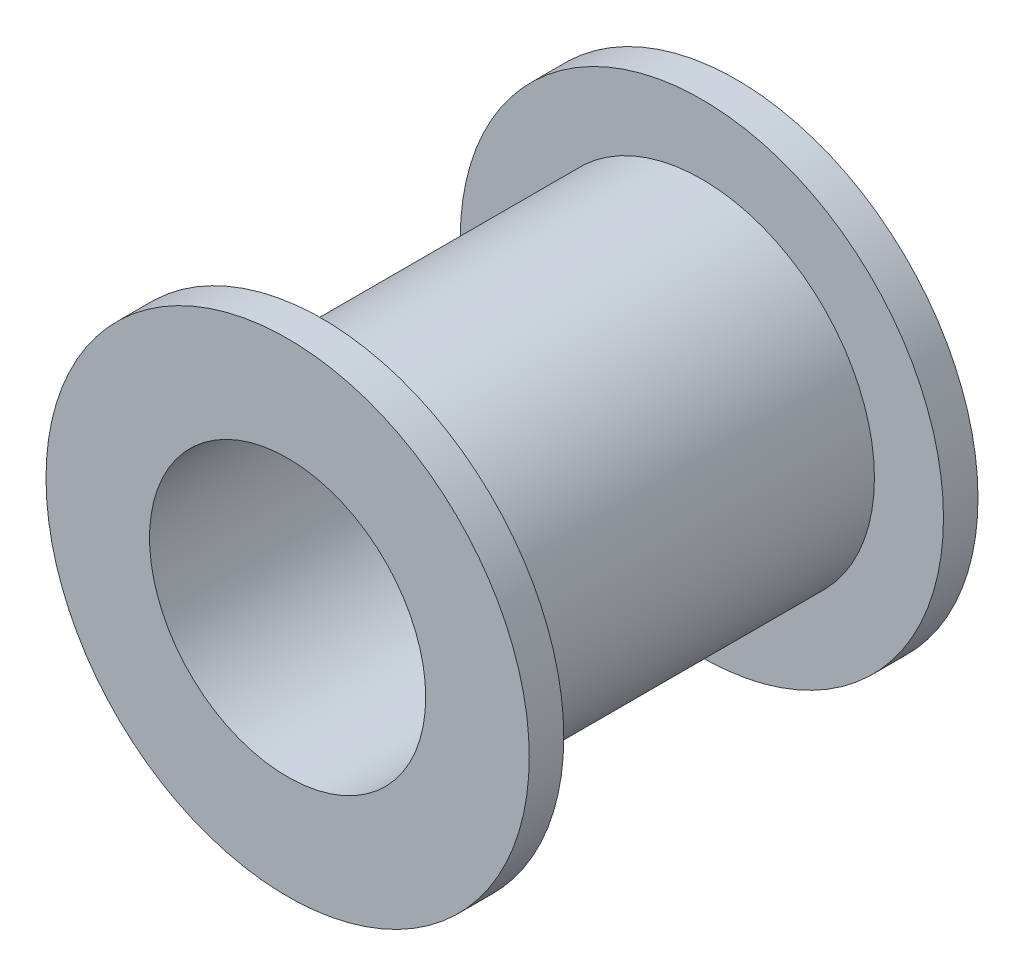
ISO-10303-21;
HEADER;
FILE_DESCRIPTION(('STEP AP214'),'2;1');
FILE_NAME('part.step','',(''),(''),'','','');
FILE_SCHEMA(('AUTOMOTIVE_DESIGN { 1 0 10303 214 1 1 1 1 }'));
ENDSEC;
DATA;
#1=APPLICATION_CONTEXT('core data for automotive mechanical design processes');
#2=APPLICATION_PROTOCOL_DEFINITION('international standard','automotive_design',2000,#1);
#3=PRODUCT_CONTEXT('',#1,'mechanical');
#4=PRODUCT('Part','Part','',(#3));
#5=PRODUCT_RELATED_PRODUCT_CATEGORY('part','',(#4));
#6=PRODUCT_DEFINITION_FORMATION('','',#4);
#7=PRODUCT_DEFINITION_CONTEXT('part definition',#1,'design');
#8=PRODUCT_DEFINITION('design','',#6,#7);
#9=PRODUCT_DEFINITION_SHAPE('','',#8);
#10=(LENGTH_UNIT() NAMED_UNIT(*) SI_UNIT(.MILLI.,.METRE.));
#11=(NAMED_UNIT(*) PLANE_ANGLE_UNIT() SI_UNIT($,.RADIAN.));
#12=(NAMED_UNIT(*) SI_UNIT($,.STERADIAN.) SOLID_ANGLE_UNIT());
#13=UNCERTAINTY_MEASURE_WITH_UNIT(LENGTH_MEASURE(1.E-05),#10,'distance_accuracy_value','');
#14=(GEOMETRIC_REPRESENTATION_CONTEXT(3) GLOBAL_UNCERTAINTY_ASSIGNED_CONTEXT((#13)) GLOBAL_UNIT_ASSIGNED_CONTEXT((#10,
#11,#12)) REPRESENTATION_CONTEXT('',''));
#15=CARTESIAN_POINT('',(0.,0.,0.));
#16=DIRECTION('',(0.,0.,1.));
#17=DIRECTION('',(1.,0.,0.));
#18=AXIS2_PLACEMENT_3D('',#15,#16,#17);
#19=CARTESIAN_POINT('',(0.,0.,0.1));
#20=DIRECTION('',(0.,0.,-1.));
#21=DIRECTION('',(1.,0.,0.));
#22=AXIS2_PLACEMENT_3D('',#19,#20,#21);
#23=CYLINDRICAL_SURFACE('',#22,0.4);
#24=DIRECTION('',(0.,0.,-1.));
#25=VECTOR('',#24,1.);
#26=CARTESIAN_POINT('',(0.4,0.,0.1));
#27=LINE('',#26,#25);
#28=CARTESIAN_POINT('',(0.4,0.,0.1));
#29=VERTEX_POINT('',#28);
#30=CARTESIAN_POINT('',(0.4,0.,-1.2));
#31=VERTEX_POINT('',#30);
#32=EDGE_CURVE('E11',#29,#31,#27,.T.);
#33=ORIENTED_EDGE('',*,*,#32,.T.);
#34=CARTESIAN_POINT('',(0.,0.,-1.2));
#35=DIRECTION('',(0.,0.,-1.));
#36=DIRECTION('',(1.,0.,0.));
#37=AXIS2_PLACEMENT_3D('',#34,#35,#36);
#38=CIRCLE('',#37,0.4);
#39=EDGE_CURVE('E119',#31,#31,#38,.T.);
#40=ORIENTED_EDGE('',*,*,#39,.T.);
#41=ORIENTED_EDGE('',*,*,#32,.F.);
#42=CARTESIAN_POINT('',(0.,0.,0.1));
#43=DIRECTION('',(0.,0.,-1.));
#44=DIRECTION('',(1.,0.,0.));
#45=AXIS2_PLACEMENT_3D('',#42,#43,#44);
#46=CIRCLE('',#45,0.4);
#47=EDGE_CURVE('E28',#29,#29,#46,.T.);
#48=ORIENTED_EDGE('',*,*,#47,.F.);
#49=EDGE_LOOP('',(#33,#40,#41,#48));
#50=FACE_BOUND('',#49,.T.);
#51=ADVANCED_FACE('F17',(#50),#23,.F.);
#52=CARTESIAN_POINT('',(0.,0.,0.1));
#53=DIRECTION('',(0.,0.,-1.));
#54=DIRECTION('',(0.,-1.,0.));
#55=AXIS2_PLACEMENT_3D('',#52,#53,#54);
#56=PLANE('',#55);
#57=ORIENTED_EDGE('',*,*,#47,.T.);
#58=EDGE_LOOP('',(#57));
#59=FACE_BOUND('',#58,.T.);
#60=CARTESIAN_POINT('',(0.,0.,0.1));
#61=DIRECTION('',(0.,0.,-1.));
#62=DIRECTION('',(1.,0.,0.));
#63=AXIS2_PLACEMENT_3D('',#60,#61,#62);
#64=CIRCLE('',#63,0.7);
#65=CARTESIAN_POINT('',(0.7,0.,0.1));
#66=VERTEX_POINT('',#65);
#67=EDGE_CURVE('E95',#66,#66,#64,.T.);
#68=ORIENTED_EDGE('',*,*,#67,.F.);
#69=EDGE_LOOP('',(#68));
#70=FACE_BOUND('',#69,.T.);
#71=ADVANCED_FACE('F134',(#59,#70),#56,.F.);
#72=CARTESIAN_POINT('',(0.,0.,0.));
#73=DIRECTION('',(0.,0.,1.));
#74=DIRECTION('',(1.,0.,0.));
#75=AXIS2_PLACEMENT_3D('',#72,#73,#74);
#76=CYLINDRICAL_SURFACE('',#75,0.7);
#77=DIRECTION('',(0.,0.,1.));
#78=VECTOR('',#77,1.);
#79=CARTESIAN_POINT('',(0.7,0.,0.));
#80=LINE('',#79,#78);
#81=CARTESIAN_POINT('',(0.7,0.,0.));
#82=VERTEX_POINT('',#81);
#83=EDGE_CURVE('E67',#82,#66,#80,.T.);
#84=ORIENTED_EDGE('',*,*,#83,.T.);
#85=ORIENTED_EDGE('',*,*,#67,.T.);
#86=ORIENTED_EDGE('',*,*,#83,.F.);
#87=CARTESIAN_POINT('',(0.,0.,0.));
#88=DIRECTION('',(0.,0.,-1.));
#89=DIRECTION('',(1.,0.,0.));
#90=AXIS2_PLACEMENT_3D('',#87,#88,#89);
#91=CIRCLE('',#90,0.7);
#92=EDGE_CURVE('E82',#82,#82,#91,.T.);
#93=ORIENTED_EDGE('',*,*,#92,.F.);
#94=EDGE_LOOP('',(#84,#85,#86,#93));
#95=FACE_BOUND('',#94,.T.);
#96=ADVANCED_FACE('F139',(#95),#76,.T.);
#97=CARTESIAN_POINT('',(0.,0.,0.));
#98=DIRECTION('',(0.,0.,-1.));
#99=DIRECTION('',(0.,-1.,0.));
#100=AXIS2_PLACEMENT_3D('',#97,#98,#99);
#101=PLANE('',#100);
#102=ORIENTED_EDGE('',*,*,#92,.T.);
#103=EDGE_LOOP('',(#102));
#104=FACE_BOUND('',#103,.T.);
#105=CARTESIAN_POINT('',(0.,0.,0.));
#106=DIRECTION('',(0.,0.,-1.));
#107=DIRECTION('',(1.,0.,0.));
#108=AXIS2_PLACEMENT_3D('',#105,#106,#107);
#109=CIRCLE('',#108,0.5);
#110=CARTESIAN_POINT('',(0.5,0.,0.));
#111=VERTEX_POINT('',#110);
#112=EDGE_CURVE('E75',#111,#111,#109,.T.);
#113=ORIENTED_EDGE('',*,*,#112,.F.);
#114=EDGE_LOOP('',(#113));
#115=FACE_BOUND('',#114,.T.);
#116=ADVANCED_FACE('F144',(#104,#115),#101,.T.);
#117=CARTESIAN_POINT('',(0.,0.,-1.1));
#118=DIRECTION('',(0.,0.,1.));
#119=DIRECTION('',(1.,0.,0.));
#120=AXIS2_PLACEMENT_3D('',#117,#118,#119);
#121=CYLINDRICAL_SURFACE('',#120,0.5);
#122=DIRECTION('',(0.,0.,1.));
#123=VECTOR('',#122,1.);
#124=CARTESIAN_POINT('',(0.5,0.,-1.1));
#125=LINE('',#124,#123);
#126=CARTESIAN_POINT('',(0.5,0.,-1.1));
#127=VERTEX_POINT('',#126);
#128=EDGE_CURVE('E78',#127,#111,#125,.T.);
#129=ORIENTED_EDGE('',*,*,#128,.T.);
#130=ORIENTED_EDGE('',*,*,#112,.T.);
#131=ORIENTED_EDGE('',*,*,#128,.F.);
#132=CARTESIAN_POINT('',(0.,0.,-1.1));
#133=DIRECTION('',(0.,0.,-1.));
#134=DIRECTION('',(1.,0.,0.));
#135=AXIS2_PLACEMENT_3D('',#132,#133,#134);
#136=CIRCLE('',#135,0.5);
#137=EDGE_CURVE('E89',#127,#127,#136,.T.);
#138=ORIENTED_EDGE('',*,*,#137,.F.);
#139=EDGE_LOOP('',(#129,#130,#131,#138));
#140=FACE_BOUND('',#139,.T.);
#141=ADVANCED_FACE('F76',(#140),#121,.T.);
#142=CARTESIAN_POINT('',(0.,0.,-1.1));
#143=DIRECTION('',(0.,0.,-1.));
#144=DIRECTION('',(0.,-1.,0.));
#145=AXIS2_PLACEMENT_3D('',#142,#143,#144);
#146=PLANE('',#145);
#147=ORIENTED_EDGE('',*,*,#137,.T.);
#148=EDGE_LOOP('',(#147));
#149=FACE_BOUND('',#148,.T.);
#150=CARTESIAN_POINT('',(0.,0.,-1.1));
#151=DIRECTION('',(0.,0.,-1.));
#152=DIRECTION('',(1.,0.,0.));
#153=AXIS2_PLACEMENT_3D('',#150,#151,#152);
#154=CIRCLE('',#153,0.7);
#155=CARTESIAN_POINT('',(0.7,0.,-1.1));
#156=VERTEX_POINT('',#155);
#157=EDGE_CURVE('E96',#156,#156,#154,.T.);
#158=ORIENTED_EDGE('',*,*,#157,.F.);
#159=EDGE_LOOP('',(#158));
#160=FACE_BOUND('',#159,.T.);
#161=ADVANCED_FACE('F108',(#149,#160),#146,.F.);
#162=CARTESIAN_POINT('',(0.,0.,-1.2));
#163=DIRECTION('',(0.,0.,1.));
#164=DIRECTION('',(1.,0.,0.));
#165=AXIS2_PLACEMENT_3D('',#162,#163,#164);
#166=CYLINDRICAL_SURFACE('',#165,0.7);
#167=DIRECTION('',(0.,0.,1.));
#168=VECTOR('',#167,1.);
#169=CARTESIAN_POINT('',(0.7,0.,-1.2));
#170=LINE('',#169,#168);
#171=CARTESIAN_POINT('',(0.7,0.,-1.2));
#172=VERTEX_POINT('',#171);
#173=EDGE_CURVE('E99',#172,#156,#170,.T.);
#174=ORIENTED_EDGE('',*,*,#173,.T.);
#175=ORIENTED_EDGE('',*,*,#157,.T.);
#176=ORIENTED_EDGE('',*,*,#173,.F.);
#177=CARTESIAN_POINT('',(0.,0.,-1.2));
#178=DIRECTION('',(0.,0.,-1.));
#179=DIRECTION('',(1.,0.,0.));
#180=AXIS2_PLACEMENT_3D('',#177,#178,#179);
#181=CIRCLE('',#180,0.7);
#182=EDGE_CURVE('E21',#172,#172,#181,.T.);
#183=ORIENTED_EDGE('',*,*,#182,.F.);
#184=EDGE_LOOP('',(#174,#175,#176,#183));
#185=FACE_BOUND('',#184,.T.);
#186=ADVANCED_FACE('F19',(#185),#166,.T.);
#187=CARTESIAN_POINT('',(0.,0.,-1.2));
#188=DIRECTION('',(0.,0.,-1.));
#189=DIRECTION('',(0.,-1.,0.));
#190=AXIS2_PLACEMENT_3D('',#187,#188,#189);
#191=PLANE('',#190);
#192=ORIENTED_EDGE('',*,*,#182,.T.);
#193=EDGE_LOOP('',(#192));
#194=FACE_BOUND('',#193,.T.);
#195=ORIENTED_EDGE('',*,*,#39,.F.);
#196=EDGE_LOOP('',(#195));
#197=FACE_BOUND('',#196,.T.);
#198=ADVANCED_FACE('F117',(#194,#197),#191,.T.);
#199=CLOSED_SHELL('',(#51,#71,#96,#116,#141,#161,#186,#198));
#200=MANIFOLD_SOLID_BREP('B1',#199);
#201=ADVANCED_BREP_SHAPE_REPRESENTATION('',(#18,#200),#14);
#202=SHAPE_DEFINITION_REPRESENTATION(#9,#201);
ENDSEC;
END-ISO-10303-21;
